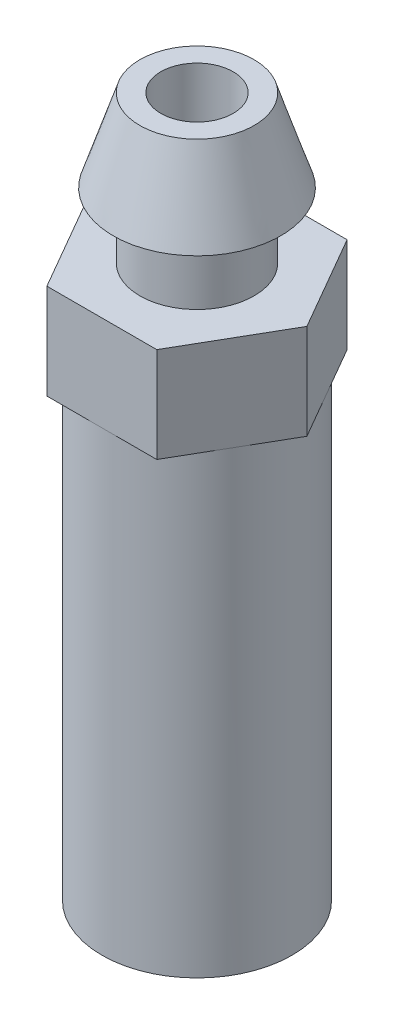
ISO-10303-21;
HEADER;
FILE_DESCRIPTION(('STEP AP214'),'2;1');
FILE_NAME('part.step','',(''),(''),'','','');
FILE_SCHEMA(('AUTOMOTIVE_DESIGN { 1 0 10303 214 1 1 1 1 }'));
ENDSEC;
DATA;
#1=APPLICATION_CONTEXT('core data for automotive mechanical design processes');
#2=APPLICATION_PROTOCOL_DEFINITION('international standard','automotive_design',2000,#1);
#3=PRODUCT_CONTEXT('',#1,'mechanical');
#4=PRODUCT('Part','Part','',(#3));
#5=PRODUCT_RELATED_PRODUCT_CATEGORY('part','',(#4));
#6=PRODUCT_DEFINITION_FORMATION('','',#4);
#7=PRODUCT_DEFINITION_CONTEXT('part definition',#1,'design');
#8=PRODUCT_DEFINITION('design','',#6,#7);
#9=PRODUCT_DEFINITION_SHAPE('','',#8);
#10=(LENGTH_UNIT() NAMED_UNIT(*) SI_UNIT(.MILLI.,.METRE.));
#11=(NAMED_UNIT(*) PLANE_ANGLE_UNIT() SI_UNIT($,.RADIAN.));
#12=(NAMED_UNIT(*) SI_UNIT($,.STERADIAN.) SOLID_ANGLE_UNIT());
#13=UNCERTAINTY_MEASURE_WITH_UNIT(LENGTH_MEASURE(1.E-05),#10,'distance_accuracy_value','');
#14=(GEOMETRIC_REPRESENTATION_CONTEXT(3) GLOBAL_UNCERTAINTY_ASSIGNED_CONTEXT((#13)) GLOBAL_UNIT_ASSIGNED_CONTEXT((#10,
#11,#12)) REPRESENTATION_CONTEXT('',''));
#15=CARTESIAN_POINT('',(0.,0.,0.));
#16=DIRECTION('',(0.,0.,1.));
#17=DIRECTION('',(1.,0.,0.));
#18=AXIS2_PLACEMENT_3D('',#15,#16,#17);
#19=CARTESIAN_POINT('',(1.905,23.3379123644705,0.));
#20=DIRECTION('',(0.,-1.,0.));
#21=DIRECTION('',(1.,0.,0.));
#22=AXIS2_PLACEMENT_3D('',#19,#20,#21);
#23=PLANE('',#22);
#24=CARTESIAN_POINT('',(0.,23.3379123644705,0.));
#25=DIRECTION('',(0.,1.,0.));
#26=DIRECTION('',(-1.,0.,0.));
#27=AXIS2_PLACEMENT_3D('',#24,#25,#26);
#28=CIRCLE('',#27,1.2065);
#29=CARTESIAN_POINT('',(-1.2065,23.3379123644705,0.));
#30=VERTEX_POINT('',#29);
#31=EDGE_CURVE('E62',#30,#30,#28,.T.);
#32=ORIENTED_EDGE('',*,*,#31,.F.);
#33=EDGE_LOOP('',(#32));
#34=FACE_BOUND('',#33,.T.);
#35=CARTESIAN_POINT('',(0.,23.3379123644705,0.));
#36=DIRECTION('',(0.,1.,0.));
#37=DIRECTION('',(-1.,0.,0.));
#38=AXIS2_PLACEMENT_3D('',#35,#36,#37);
#39=CIRCLE('',#38,1.905);
#40=CARTESIAN_POINT('',(-1.905,23.3379123644705,0.));
#41=VERTEX_POINT('',#40);
#42=EDGE_CURVE('E60',#41,#41,#39,.T.);
#43=ORIENTED_EDGE('',*,*,#42,.T.);
#44=EDGE_LOOP('',(#43));
#45=FACE_BOUND('',#44,.T.);
#46=ADVANCED_FACE('F47',(#34,#45),#23,.F.);
#47=CARTESIAN_POINT('',(0.,20.5947123644705,0.));
#48=DIRECTION('',(0.,1.,0.));
#49=DIRECTION('',(-1.,0.,0.));
#50=AXIS2_PLACEMENT_3D('',#47,#48,#49);
#51=PLANE('',#50);
#52=CARTESIAN_POINT('',(0.,20.5947123644705,0.));
#53=DIRECTION('',(0.,1.,0.));
#54=DIRECTION('',(-1.,0.,0.));
#55=AXIS2_PLACEMENT_3D('',#52,#53,#54);
#56=CIRCLE('',#55,1.2065);
#57=CARTESIAN_POINT('',(-1.2065,20.5947123644705,0.));
#58=VERTEX_POINT('',#57);
#59=EDGE_CURVE('E55',#58,#58,#56,.T.);
#60=ORIENTED_EDGE('',*,*,#59,.T.);
#61=EDGE_LOOP('',(#60));
#62=FACE_BOUND('',#61,.T.);
#63=CARTESIAN_POINT('',(0.,20.5947123644705,0.));
#64=DIRECTION('',(0.,1.,0.));
#65=DIRECTION('',(-1.,0.,0.));
#66=AXIS2_PLACEMENT_3D('',#63,#64,#65);
#67=CIRCLE('',#66,2.794);
#68=CARTESIAN_POINT('',(-2.794,20.5947123644705,0.));
#69=VERTEX_POINT('',#68);
#70=EDGE_CURVE('E11',#69,#69,#67,.T.);
#71=ORIENTED_EDGE('',*,*,#70,.F.);
#72=EDGE_LOOP('',(#71));
#73=FACE_BOUND('',#72,.T.);
#74=ADVANCED_FACE('F71',(#62,#73),#51,.F.);
#75=CARTESIAN_POINT('',(0.,20.5947123644705,0.));
#76=DIRECTION('',(0.,-1.,0.));
#77=DIRECTION('',(1.,0.,0.));
#78=AXIS2_PLACEMENT_3D('',#75,#76,#77);
#79=CONICAL_SURFACE('',#78,2.794,0.313394202945207);
#80=ORIENTED_EDGE('',*,*,#42,.F.);
#81=EDGE_LOOP('',(#80));
#82=FACE_BOUND('',#81,.T.);
#83=ORIENTED_EDGE('',*,*,#70,.T.);
#84=EDGE_LOOP('',(#83));
#85=FACE_BOUND('',#84,.T.);
#86=ADVANCED_FACE('F80',(#82,#85),#79,.T.);
#87=CARTESIAN_POINT('',(0.,13.6859123644705,0.));
#88=DIRECTION('',(0.,1.,0.));
#89=DIRECTION('',(-1.,0.,0.));
#90=AXIS2_PLACEMENT_3D('',#87,#88,#89);
#91=CYLINDRICAL_SURFACE('',#90,1.2065);
#92=ORIENTED_EDGE('',*,*,#31,.T.);
#93=EDGE_LOOP('',(#92));
#94=FACE_BOUND('',#93,.T.);
#95=ORIENTED_EDGE('',*,*,#59,.F.);
#96=EDGE_LOOP('',(#95));
#97=FACE_BOUND('',#96,.T.);
#98=ADVANCED_FACE('F79',(#94,#97),#91,.F.);
#99=CLOSED_SHELL('',(#46,#74,#86,#98));
#100=MANIFOLD_SOLID_BREP('B2',#99);
#101=CARTESIAN_POINT('',(0.,15.24,0.));
#102=DIRECTION('',(0.,-1.,0.));
#103=DIRECTION('',(0.,0.,-1.));
#104=AXIS2_PLACEMENT_3D('',#101,#102,#103);
#105=CYLINDRICAL_SURFACE('',#104,3.175);
#106=CARTESIAN_POINT('',(0.,15.24,0.));
#107=DIRECTION('',(0.,1.,0.));
#108=DIRECTION('',(0.,0.,1.));
#109=AXIS2_PLACEMENT_3D('',#106,#107,#108);
#110=CIRCLE('',#109,3.175);
#111=CARTESIAN_POINT('',(0.,15.24,3.175));
#112=VERTEX_POINT('',#111);
#113=CARTESIAN_POINT('',(2.74963065701559,15.24,1.5875));
#114=VERTEX_POINT('',#113);
#115=EDGE_CURVE('E117',#112,#114,#110,.T.);
#116=ORIENTED_EDGE('',*,*,#115,.F.);
#117=CARTESIAN_POINT('',(-2.7496306570156,15.24,1.5875));
#118=VERTEX_POINT('',#117);
#119=EDGE_CURVE('E126',#118,#112,#110,.T.);
#120=ORIENTED_EDGE('',*,*,#119,.F.);
#121=CARTESIAN_POINT('',(-2.7496306570156,15.24,-1.5875));
#122=VERTEX_POINT('',#121);
#123=EDGE_CURVE('E131',#122,#118,#110,.T.);
#124=ORIENTED_EDGE('',*,*,#123,.F.);
#125=CARTESIAN_POINT('',(0.,15.24,-3.175));
#126=VERTEX_POINT('',#125);
#127=EDGE_CURVE('E244',#126,#122,#110,.T.);
#128=ORIENTED_EDGE('',*,*,#127,.F.);
#129=CARTESIAN_POINT('',(2.74963065701559,15.24,-1.5875));
#130=VERTEX_POINT('',#129);
#131=EDGE_CURVE('E235',#130,#126,#110,.T.);
#132=ORIENTED_EDGE('',*,*,#131,.F.);
#133=EDGE_CURVE('E223',#114,#130,#110,.T.);
#134=ORIENTED_EDGE('',*,*,#133,.F.);
#135=EDGE_LOOP('',(#116,#120,#124,#128,#132,#134));
#136=FACE_BOUND('',#135,.T.);
#137=CARTESIAN_POINT('',(0.,0.,0.));
#138=DIRECTION('',(0.,1.,0.));
#139=DIRECTION('',(0.,0.,1.));
#140=AXIS2_PLACEMENT_3D('',#137,#138,#139);
#141=CIRCLE('',#140,3.175);
#142=CARTESIAN_POINT('',(0.,0.,3.175));
#143=VERTEX_POINT('',#142);
#144=EDGE_CURVE('E215',#143,#143,#141,.T.);
#145=ORIENTED_EDGE('',*,*,#144,.T.);
#146=EDGE_LOOP('',(#145));
#147=FACE_BOUND('',#146,.T.);
#148=ADVANCED_FACE('F112',(#136,#147),#105,.T.);
#149=CARTESIAN_POINT('',(0.,0.,0.));
#150=DIRECTION('',(0.,1.,0.));
#151=DIRECTION('',(0.,0.,1.));
#152=AXIS2_PLACEMENT_3D('',#149,#150,#151);
#153=PLANE('',#152);
#154=ORIENTED_EDGE('',*,*,#144,.F.);
#155=EDGE_LOOP('',(#154));
#156=FACE_BOUND('',#155,.T.);
#157=ADVANCED_FACE('F344',(#156),#153,.F.);
#158=CARTESIAN_POINT('',(0.,15.24,0.));
#159=DIRECTION('',(0.,1.,0.));
#160=DIRECTION('',(0.,0.,1.));
#161=AXIS2_PLACEMENT_3D('',#158,#159,#160);
#162=PLANE('',#161);
#163=DIRECTION('',(1.,0.,0.));
#164=VECTOR('',#163,1.);
#165=CARTESIAN_POINT('',(-1.83308710467707,15.24,3.175));
#166=LINE('',#165,#164);
#167=CARTESIAN_POINT('',(1.83308710467706,15.24,3.175));
#168=VERTEX_POINT('',#167);
#169=EDGE_CURVE('E289',#112,#168,#166,.T.);
#170=ORIENTED_EDGE('',*,*,#169,.F.);
#171=ORIENTED_EDGE('',*,*,#115,.T.);
#172=DIRECTION('',(0.5,0.,-0.866025403784439));
#173=VECTOR('',#172,1.);
#174=CARTESIAN_POINT('',(1.83308710467706,15.24,3.175));
#175=LINE('',#174,#173);
#176=EDGE_CURVE('E311',#168,#114,#175,.T.);
#177=ORIENTED_EDGE('',*,*,#176,.F.);
#178=EDGE_LOOP('',(#170,#171,#177));
#179=FACE_BOUND('',#178,.T.);
#180=ADVANCED_FACE('F343',(#179),#162,.F.);
#181=CARTESIAN_POINT('',(3.66617420935412,15.24,0.));
#182=VERTEX_POINT('',#181);
#183=EDGE_CURVE('E207',#114,#182,#175,.T.);
#184=ORIENTED_EDGE('',*,*,#183,.F.);
#185=ORIENTED_EDGE('',*,*,#133,.T.);
#186=DIRECTION('',(-0.5,0.,-0.866025403784438));
#187=VECTOR('',#186,1.);
#188=CARTESIAN_POINT('',(3.66617420935412,15.24,0.));
#189=LINE('',#188,#187);
#190=EDGE_CURVE('E271',#182,#130,#189,.T.);
#191=ORIENTED_EDGE('',*,*,#190,.F.);
#192=EDGE_LOOP('',(#184,#185,#191));
#193=FACE_BOUND('',#192,.T.);
#194=ADVANCED_FACE('F349',(#193),#162,.F.);
#195=CARTESIAN_POINT('',(1.83308710467706,15.24,-3.175));
#196=VERTEX_POINT('',#195);
#197=EDGE_CURVE('E265',#130,#196,#189,.T.);
#198=ORIENTED_EDGE('',*,*,#197,.F.);
#199=ORIENTED_EDGE('',*,*,#131,.T.);
#200=DIRECTION('',(-1.,0.,0.));
#201=VECTOR('',#200,1.);
#202=CARTESIAN_POINT('',(1.83308710467706,15.24,-3.175));
#203=LINE('',#202,#201);
#204=EDGE_CURVE('E261',#196,#126,#203,.T.);
#205=ORIENTED_EDGE('',*,*,#204,.F.);
#206=EDGE_LOOP('',(#198,#199,#205));
#207=FACE_BOUND('',#206,.T.);
#208=ADVANCED_FACE('F259',(#207),#162,.F.);
#209=CARTESIAN_POINT('',(-1.83308710467706,15.24,-3.17500000000001));
#210=VERTEX_POINT('',#209);
#211=EDGE_CURVE('E263',#126,#210,#203,.T.);
#212=ORIENTED_EDGE('',*,*,#211,.F.);
#213=ORIENTED_EDGE('',*,*,#127,.T.);
#214=DIRECTION('',(-0.5,0.,0.866025403784439));
#215=VECTOR('',#214,1.);
#216=CARTESIAN_POINT('',(-1.83308710467706,15.24,-3.17500000000001));
#217=LINE('',#216,#215);
#218=EDGE_CURVE('E266',#210,#122,#217,.T.);
#219=ORIENTED_EDGE('',*,*,#218,.F.);
#220=EDGE_LOOP('',(#212,#213,#219));
#221=FACE_BOUND('',#220,.T.);
#222=ADVANCED_FACE('F262',(#221),#162,.F.);
#223=CARTESIAN_POINT('',(-3.66617420935413,15.24,0.));
#224=VERTEX_POINT('',#223);
#225=EDGE_CURVE('E274',#122,#224,#217,.T.);
#226=ORIENTED_EDGE('',*,*,#225,.F.);
#227=ORIENTED_EDGE('',*,*,#123,.T.);
#228=DIRECTION('',(0.5,0.,0.866025403784439));
#229=VECTOR('',#228,1.);
#230=CARTESIAN_POINT('',(-3.66617420935413,15.24,0.));
#231=LINE('',#230,#229);
#232=EDGE_CURVE('E285',#224,#118,#231,.T.);
#233=ORIENTED_EDGE('',*,*,#232,.F.);
#234=EDGE_LOOP('',(#226,#227,#233));
#235=FACE_BOUND('',#234,.T.);
#236=ADVANCED_FACE('F376',(#235),#162,.F.);
#237=CARTESIAN_POINT('',(-1.83308710467707,15.24,3.175));
#238=VERTEX_POINT('',#237);
#239=EDGE_CURVE('E281',#118,#238,#231,.T.);
#240=ORIENTED_EDGE('',*,*,#239,.F.);
#241=ORIENTED_EDGE('',*,*,#119,.T.);
#242=EDGE_CURVE('E204',#238,#112,#166,.T.);
#243=ORIENTED_EDGE('',*,*,#242,.F.);
#244=EDGE_LOOP('',(#240,#241,#243));
#245=FACE_BOUND('',#244,.T.);
#246=ADVANCED_FACE('F352',(#245),#162,.F.);
#247=CARTESIAN_POINT('',(1.83308710467706,18.415,3.175));
#248=DIRECTION('',(-0.866025403784439,0.,-0.5));
#249=DIRECTION('',(-0.5,0.,0.866025403784439));
#250=AXIS2_PLACEMENT_3D('',#247,#248,#249);
#251=PLANE('',#250);
#252=ORIENTED_EDGE('',*,*,#176,.T.);
#253=ORIENTED_EDGE('',*,*,#183,.T.);
#254=DIRECTION('',(0.,-1.,0.));
#255=VECTOR('',#254,1.);
#256=CARTESIAN_POINT('',(3.66617420935412,18.415,0.));
#257=LINE('',#256,#255);
#258=CARTESIAN_POINT('',(3.66617420935412,18.415,0.));
#259=VERTEX_POINT('',#258);
#260=EDGE_CURVE('E186',#259,#182,#257,.T.);
#261=ORIENTED_EDGE('',*,*,#260,.F.);
#262=DIRECTION('',(0.5,0.,-0.866025403784439));
#263=VECTOR('',#262,1.);
#264=CARTESIAN_POINT('',(1.83308710467706,18.415,3.175));
#265=LINE('',#264,#263);
#266=CARTESIAN_POINT('',(1.83308710467706,18.415,3.175));
#267=VERTEX_POINT('',#266);
#268=EDGE_CURVE('E193',#267,#259,#265,.T.);
#269=ORIENTED_EDGE('',*,*,#268,.F.);
#270=DIRECTION('',(0.,-1.,0.));
#271=VECTOR('',#270,1.);
#272=CARTESIAN_POINT('',(1.83308710467706,18.415,3.175));
#273=LINE('',#272,#271);
#274=EDGE_CURVE('E287',#267,#168,#273,.T.);
#275=ORIENTED_EDGE('',*,*,#274,.T.);
#276=EDGE_LOOP('',(#252,#253,#261,#269,#275));
#277=FACE_BOUND('',#276,.T.);
#278=ADVANCED_FACE('F210',(#277),#251,.F.);
#279=CARTESIAN_POINT('',(3.66617420935412,18.415,0.));
#280=DIRECTION('',(-0.866025403784438,0.,0.5));
#281=DIRECTION('',(0.5,0.,0.866025403784439));
#282=AXIS2_PLACEMENT_3D('',#279,#280,#281);
#283=PLANE('',#282);
#284=ORIENTED_EDGE('',*,*,#190,.T.);
#285=ORIENTED_EDGE('',*,*,#197,.T.);
#286=DIRECTION('',(0.,-1.,0.));
#287=VECTOR('',#286,1.);
#288=CARTESIAN_POINT('',(1.83308710467706,18.415,-3.175));
#289=LINE('',#288,#287);
#290=CARTESIAN_POINT('',(1.83308710467706,18.415,-3.175));
#291=VERTEX_POINT('',#290);
#292=EDGE_CURVE('E188',#291,#196,#289,.T.);
#293=ORIENTED_EDGE('',*,*,#292,.F.);
#294=DIRECTION('',(-0.5,0.,-0.866025403784438));
#295=VECTOR('',#294,1.);
#296=CARTESIAN_POINT('',(3.66617420935412,18.415,0.));
#297=LINE('',#296,#295);
#298=EDGE_CURVE('E185',#259,#291,#297,.T.);
#299=ORIENTED_EDGE('',*,*,#298,.F.);
#300=ORIENTED_EDGE('',*,*,#260,.T.);
#301=EDGE_LOOP('',(#284,#285,#293,#299,#300));
#302=FACE_BOUND('',#301,.T.);
#303=ADVANCED_FACE('F183',(#302),#283,.F.);
#304=CARTESIAN_POINT('',(1.83308710467706,18.415,-3.175));
#305=DIRECTION('',(0.,0.,1.));
#306=DIRECTION('',(1.,0.,0.));
#307=AXIS2_PLACEMENT_3D('',#304,#305,#306);
#308=PLANE('',#307);
#309=ORIENTED_EDGE('',*,*,#204,.T.);
#310=ORIENTED_EDGE('',*,*,#211,.T.);
#311=DIRECTION('',(0.,-1.,0.));
#312=VECTOR('',#311,1.);
#313=CARTESIAN_POINT('',(-1.83308710467706,18.415,-3.17500000000001));
#314=LINE('',#313,#312);
#315=CARTESIAN_POINT('',(-1.83308710467706,18.415,-3.17500000000001));
#316=VERTEX_POINT('',#315);
#317=EDGE_CURVE('E218',#316,#210,#314,.T.);
#318=ORIENTED_EDGE('',*,*,#317,.F.);
#319=DIRECTION('',(-1.,0.,0.));
#320=VECTOR('',#319,1.);
#321=CARTESIAN_POINT('',(1.83308710467706,18.415,-3.175));
#322=LINE('',#321,#320);
#323=EDGE_CURVE('E195',#291,#316,#322,.T.);
#324=ORIENTED_EDGE('',*,*,#323,.F.);
#325=ORIENTED_EDGE('',*,*,#292,.T.);
#326=EDGE_LOOP('',(#309,#310,#318,#324,#325));
#327=FACE_BOUND('',#326,.T.);
#328=ADVANCED_FACE('F272',(#327),#308,.F.);
#329=CARTESIAN_POINT('',(-1.83308710467706,18.415,-3.17500000000001));
#330=DIRECTION('',(0.866025403784439,0.,0.5));
#331=DIRECTION('',(0.5,0.,-0.866025403784439));
#332=AXIS2_PLACEMENT_3D('',#329,#330,#331);
#333=PLANE('',#332);
#334=ORIENTED_EDGE('',*,*,#218,.T.);
#335=ORIENTED_EDGE('',*,*,#225,.T.);
#336=DIRECTION('',(0.,-1.,0.));
#337=VECTOR('',#336,1.);
#338=CARTESIAN_POINT('',(-3.66617420935413,18.415,0.));
#339=LINE('',#338,#337);
#340=CARTESIAN_POINT('',(-3.66617420935413,18.415,0.));
#341=VERTEX_POINT('',#340);
#342=EDGE_CURVE('E296',#341,#224,#339,.T.);
#343=ORIENTED_EDGE('',*,*,#342,.F.);
#344=DIRECTION('',(-0.5,0.,0.866025403784439));
#345=VECTOR('',#344,1.);
#346=CARTESIAN_POINT('',(-1.83308710467706,18.415,-3.17500000000001));
#347=LINE('',#346,#345);
#348=EDGE_CURVE('E303',#316,#341,#347,.T.);
#349=ORIENTED_EDGE('',*,*,#348,.F.);
#350=ORIENTED_EDGE('',*,*,#317,.T.);
#351=EDGE_LOOP('',(#334,#335,#343,#349,#350));
#352=FACE_BOUND('',#351,.T.);
#353=ADVANCED_FACE('F301',(#352),#333,.F.);
#354=CARTESIAN_POINT('',(-3.66617420935413,18.415,0.));
#355=DIRECTION('',(0.866025403784439,0.,-0.5));
#356=DIRECTION('',(-0.5,0.,-0.866025403784439));
#357=AXIS2_PLACEMENT_3D('',#354,#355,#356);
#358=PLANE('',#357);
#359=ORIENTED_EDGE('',*,*,#232,.T.);
#360=ORIENTED_EDGE('',*,*,#239,.T.);
#361=DIRECTION('',(0.,-1.,0.));
#362=VECTOR('',#361,1.);
#363=CARTESIAN_POINT('',(-1.83308710467707,18.415,3.175));
#364=LINE('',#363,#362);
#365=CARTESIAN_POINT('',(-1.83308710467707,18.415,3.175));
#366=VERTEX_POINT('',#365);
#367=EDGE_CURVE('E291',#366,#238,#364,.T.);
#368=ORIENTED_EDGE('',*,*,#367,.F.);
#369=DIRECTION('',(0.5,0.,0.866025403784439));
#370=VECTOR('',#369,1.);
#371=CARTESIAN_POINT('',(-3.66617420935413,18.415,0.));
#372=LINE('',#371,#370);
#373=EDGE_CURVE('E310',#341,#366,#372,.T.);
#374=ORIENTED_EDGE('',*,*,#373,.F.);
#375=ORIENTED_EDGE('',*,*,#342,.T.);
#376=EDGE_LOOP('',(#359,#360,#368,#374,#375));
#377=FACE_BOUND('',#376,.T.);
#378=ADVANCED_FACE('F362',(#377),#358,.F.);
#379=CARTESIAN_POINT('',(-1.83308710467707,18.415,3.175));
#380=DIRECTION('',(0.,0.,-1.));
#381=DIRECTION('',(-1.,0.,0.));
#382=AXIS2_PLACEMENT_3D('',#379,#380,#381);
#383=PLANE('',#382);
#384=ORIENTED_EDGE('',*,*,#242,.T.);
#385=ORIENTED_EDGE('',*,*,#169,.T.);
#386=ORIENTED_EDGE('',*,*,#274,.F.);
#387=DIRECTION('',(1.,0.,0.));
#388=VECTOR('',#387,1.);
#389=CARTESIAN_POINT('',(-1.83308710467707,18.415,3.175));
#390=LINE('',#389,#388);
#391=EDGE_CURVE('E200',#366,#267,#390,.T.);
#392=ORIENTED_EDGE('',*,*,#391,.F.);
#393=ORIENTED_EDGE('',*,*,#367,.T.);
#394=EDGE_LOOP('',(#384,#385,#386,#392,#393));
#395=FACE_BOUND('',#394,.T.);
#396=ADVANCED_FACE('F358',(#395),#383,.F.);
#397=CARTESIAN_POINT('',(0.,18.415,0.));
#398=DIRECTION('',(0.,1.,0.));
#399=DIRECTION('',(0.,0.,1.));
#400=AXIS2_PLACEMENT_3D('',#397,#398,#399);
#401=PLANE('',#400);
#402=CARTESIAN_POINT('',(0.,18.415,0.));
#403=DIRECTION('',(0.,1.,0.));
#404=DIRECTION('',(0.,0.,1.));
#405=AXIS2_PLACEMENT_3D('',#402,#403,#404);
#406=CIRCLE('',#405,1.905);
#407=CARTESIAN_POINT('',(0.,18.415,1.905));
#408=VERTEX_POINT('',#407);
#409=EDGE_CURVE('E50',#408,#408,#406,.T.);
#410=ORIENTED_EDGE('',*,*,#409,.F.);
#411=EDGE_LOOP('',(#410));
#412=FACE_BOUND('',#411,.T.);
#413=ORIENTED_EDGE('',*,*,#268,.T.);
#414=ORIENTED_EDGE('',*,*,#298,.T.);
#415=ORIENTED_EDGE('',*,*,#323,.T.);
#416=ORIENTED_EDGE('',*,*,#348,.T.);
#417=ORIENTED_EDGE('',*,*,#373,.T.);
#418=ORIENTED_EDGE('',*,*,#391,.T.);
#419=EDGE_LOOP('',(#413,#414,#415,#416,#417,#418));
#420=FACE_BOUND('',#419,.T.);
#421=ADVANCED_FACE('F197',(#412,#420),#401,.T.);
#422=CARTESIAN_POINT('',(0.,20.447,0.));
#423=DIRECTION('',(0.,-1.,0.));
#424=DIRECTION('',(0.,0.,-1.));
#425=AXIS2_PLACEMENT_3D('',#422,#423,#424);
#426=CYLINDRICAL_SURFACE('',#425,1.905);
#427=CARTESIAN_POINT('',(0.,20.447,0.));
#428=DIRECTION('',(0.,1.,0.));
#429=DIRECTION('',(0.,0.,1.));
#430=AXIS2_PLACEMENT_3D('',#427,#428,#429);
#431=CIRCLE('',#430,1.905);
#432=CARTESIAN_POINT('',(0.,20.447,1.905));
#433=VERTEX_POINT('',#432);
#434=EDGE_CURVE('E314',#433,#433,#431,.T.);
#435=ORIENTED_EDGE('',*,*,#434,.F.);
#436=EDGE_LOOP('',(#435));
#437=FACE_BOUND('',#436,.T.);
#438=ORIENTED_EDGE('',*,*,#409,.T.);
#439=EDGE_LOOP('',(#438));
#440=FACE_BOUND('',#439,.T.);
#441=ADVANCED_FACE('F336',(#437,#440),#426,.T.);
#442=CARTESIAN_POINT('',(0.,20.447,0.));
#443=DIRECTION('',(0.,1.,0.));
#444=DIRECTION('',(0.,0.,1.));
#445=AXIS2_PLACEMENT_3D('',#442,#443,#444);
#446=PLANE('',#445);
#447=CARTESIAN_POINT('',(0.,20.447,0.));
#448=DIRECTION('',(0.,1.,0.));
#449=DIRECTION('',(0.,0.,1.));
#450=AXIS2_PLACEMENT_3D('',#447,#448,#449);
#451=CIRCLE('',#450,1.2065);
#452=CARTESIAN_POINT('',(0.,20.447,1.2065));
#453=VERTEX_POINT('',#452);
#454=EDGE_CURVE('E111',#453,#453,#451,.T.);
#455=ORIENTED_EDGE('',*,*,#454,.F.);
#456=EDGE_LOOP('',(#455));
#457=FACE_BOUND('',#456,.T.);
#458=ORIENTED_EDGE('',*,*,#434,.T.);
#459=EDGE_LOOP('',(#458));
#460=FACE_BOUND('',#459,.T.);
#461=ADVANCED_FACE('F329',(#457,#460),#446,.T.);
#462=CARTESIAN_POINT('',(0.,13.6859123644705,0.));
#463=DIRECTION('',(0.,1.,0.));
#464=DIRECTION('',(-1.,0.,0.));
#465=AXIS2_PLACEMENT_3D('',#462,#463,#464);
#466=CYLINDRICAL_SURFACE('',#465,1.2065);
#467=ORIENTED_EDGE('',*,*,#454,.T.);
#468=EDGE_LOOP('',(#467));
#469=FACE_BOUND('',#468,.T.);
#470=CARTESIAN_POINT('',(0.,13.6859123644705,0.));
#471=DIRECTION('',(0.,1.,0.));
#472=DIRECTION('',(-1.,0.,0.));
#473=AXIS2_PLACEMENT_3D('',#470,#471,#472);
#474=CIRCLE('',#473,1.2065);
#475=CARTESIAN_POINT('',(-1.2065,13.6859123644705,0.));
#476=VERTEX_POINT('',#475);
#477=EDGE_CURVE('E321',#476,#476,#474,.T.);
#478=ORIENTED_EDGE('',*,*,#477,.F.);
#479=EDGE_LOOP('',(#478));
#480=FACE_BOUND('',#479,.T.);
#481=ADVANCED_FACE('F327',(#469,#480),#466,.F.);
#482=CARTESIAN_POINT('',(0.,13.6859123644705,0.));
#483=DIRECTION('',(0.,1.,0.));
#484=DIRECTION('',(-1.,0.,0.));
#485=AXIS2_PLACEMENT_3D('',#482,#483,#484);
#486=PLANE('',#485);
#487=ORIENTED_EDGE('',*,*,#477,.T.);
#488=EDGE_LOOP('',(#487));
#489=FACE_BOUND('',#488,.T.);
#490=ADVANCED_FACE('F326',(#489),#486,.T.);
#491=CLOSED_SHELL('',(#148,#157,#180,#194,#208,#222,#236,#246,#278,#303,#328,#353,#378,#396,
#421,#441,#461,#481,#490));
#492=MANIFOLD_SOLID_BREP('B6',#491);
#493=ADVANCED_BREP_SHAPE_REPRESENTATION('',(#18,#100,#492),#14);
#494=SHAPE_DEFINITION_REPRESENTATION(#9,#493);
ENDSEC;
END-ISO-10303-21;
